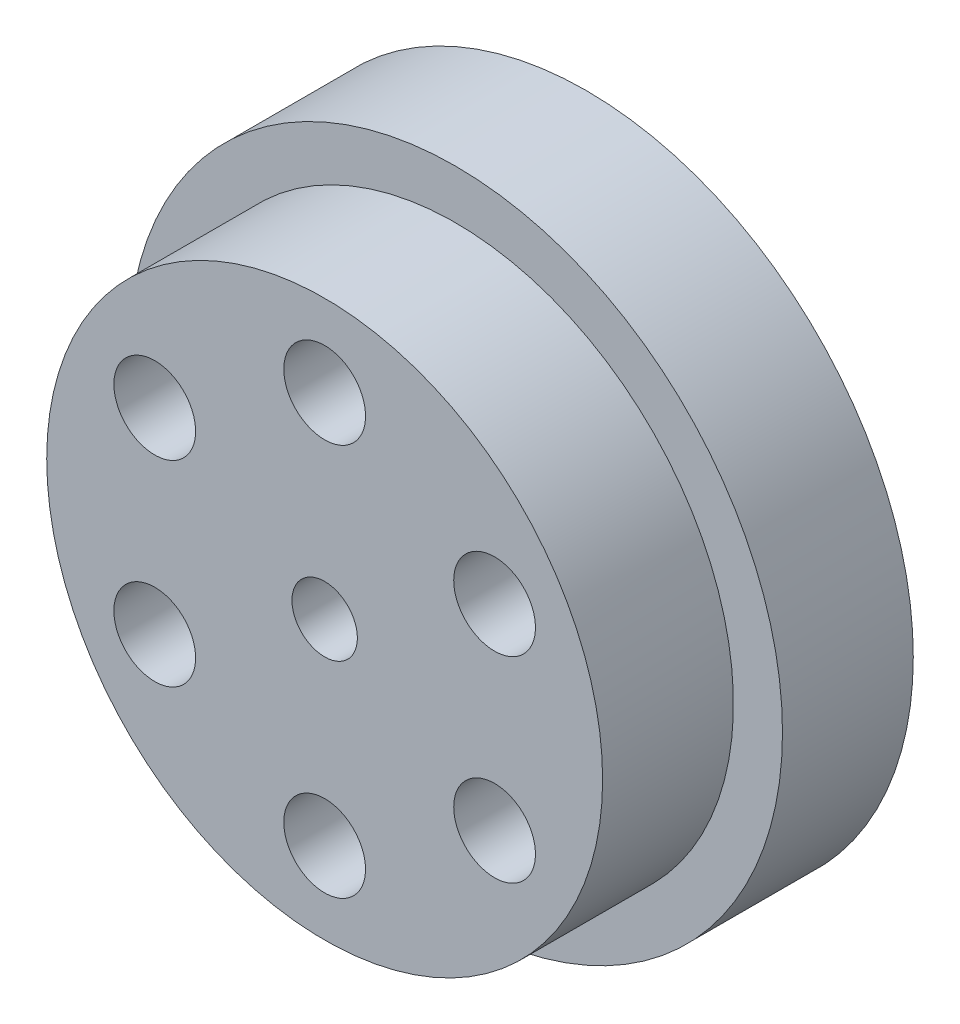
ISO-10303-21;
HEADER;
FILE_DESCRIPTION(('STEP AP214'),'2;1');
FILE_NAME('part.step','',(''),(''),'','','');
FILE_SCHEMA(('AUTOMOTIVE_DESIGN { 1 0 10303 214 1 1 1 1 }'));
ENDSEC;
DATA;
#1=APPLICATION_CONTEXT('core data for automotive mechanical design processes');
#2=APPLICATION_PROTOCOL_DEFINITION('international standard','automotive_design',2000,#1);
#3=PRODUCT_CONTEXT('',#1,'mechanical');
#4=PRODUCT('Part','Part','',(#3));
#5=PRODUCT_RELATED_PRODUCT_CATEGORY('part','',(#4));
#6=PRODUCT_DEFINITION_FORMATION('','',#4);
#7=PRODUCT_DEFINITION_CONTEXT('part definition',#1,'design');
#8=PRODUCT_DEFINITION('design','',#6,#7);
#9=PRODUCT_DEFINITION_SHAPE('','',#8);
#10=(LENGTH_UNIT() NAMED_UNIT(*) SI_UNIT(.MILLI.,.METRE.));
#11=(NAMED_UNIT(*) PLANE_ANGLE_UNIT() SI_UNIT($,.RADIAN.));
#12=(NAMED_UNIT(*) SI_UNIT($,.STERADIAN.) SOLID_ANGLE_UNIT());
#13=UNCERTAINTY_MEASURE_WITH_UNIT(LENGTH_MEASURE(1.E-05),#10,'distance_accuracy_value','');
#14=(GEOMETRIC_REPRESENTATION_CONTEXT(3) GLOBAL_UNCERTAINTY_ASSIGNED_CONTEXT((#13)) GLOBAL_UNIT_ASSIGNED_CONTEXT((#10,
#11,#12)) REPRESENTATION_CONTEXT('',''));
#15=CARTESIAN_POINT('',(0.,0.,0.));
#16=DIRECTION('',(0.,0.,1.));
#17=DIRECTION('',(1.,0.,0.));
#18=AXIS2_PLACEMENT_3D('',#15,#16,#17);
#19=CARTESIAN_POINT('',(0.,0.,5.));
#20=DIRECTION('',(0.,0.,-1.));
#21=DIRECTION('',(-1.,0.,0.));
#22=AXIS2_PLACEMENT_3D('',#19,#20,#21);
#23=CYLINDRICAL_SURFACE('',#22,2.5);
#24=CARTESIAN_POINT('',(0.,0.,-3.));
#25=DIRECTION('',(0.,0.,-1.));
#26=DIRECTION('',(-1.,0.,0.));
#27=AXIS2_PLACEMENT_3D('',#24,#25,#26);
#28=CIRCLE('',#27,2.5);
#29=CARTESIAN_POINT('',(-2.5,0.,-3.));
#30=VERTEX_POINT('',#29);
#31=EDGE_CURVE('E95',#30,#30,#28,.T.);
#32=ORIENTED_EDGE('',*,*,#31,.T.);
#33=EDGE_LOOP('',(#32));
#34=FACE_BOUND('',#33,.T.);
#35=CARTESIAN_POINT('',(0.,0.,-1.));
#36=DIRECTION('',(0.,0.,1.));
#37=DIRECTION('',(1.,0.,0.));
#38=AXIS2_PLACEMENT_3D('',#35,#36,#37);
#39=CIRCLE('',#38,2.5);
#40=CARTESIAN_POINT('',(2.5,0.,-1.));
#41=VERTEX_POINT('',#40);
#42=EDGE_CURVE('E122',#41,#41,#39,.T.);
#43=ORIENTED_EDGE('',*,*,#42,.T.);
#44=EDGE_LOOP('',(#43));
#45=FACE_BOUND('',#44,.T.);
#46=ADVANCED_FACE('F46',(#34,#45),#23,.F.);
#47=CARTESIAN_POINT('',(0.,0.,5.));
#48=DIRECTION('',(0.,0.,-1.));
#49=DIRECTION('',(-1.,0.,0.));
#50=AXIS2_PLACEMENT_3D('',#47,#48,#49);
#51=CYLINDRICAL_SURFACE('',#50,8.5);
#52=CARTESIAN_POINT('',(0.,0.,5.));
#53=DIRECTION('',(0.,0.,1.));
#54=DIRECTION('',(1.,0.,0.));
#55=AXIS2_PLACEMENT_3D('',#52,#53,#54);
#56=CIRCLE('',#55,8.5);
#57=CARTESIAN_POINT('',(8.5,0.,5.));
#58=VERTEX_POINT('',#57);
#59=EDGE_CURVE('E55',#58,#58,#56,.T.);
#60=ORIENTED_EDGE('',*,*,#59,.F.);
#61=EDGE_LOOP('',(#60));
#62=FACE_BOUND('',#61,.T.);
#63=CARTESIAN_POINT('',(0.,0.,1.));
#64=DIRECTION('',(0.,0.,-1.));
#65=DIRECTION('',(-1.,0.,0.));
#66=AXIS2_PLACEMENT_3D('',#63,#64,#65);
#67=CIRCLE('',#66,8.5);
#68=CARTESIAN_POINT('',(-8.5,0.,1.));
#69=VERTEX_POINT('',#68);
#70=EDGE_CURVE('E10',#69,#69,#67,.T.);
#71=ORIENTED_EDGE('',*,*,#70,.F.);
#72=EDGE_LOOP('',(#71));
#73=FACE_BOUND('',#72,.T.);
#74=ADVANCED_FACE('F48',(#62,#73),#51,.T.);
#75=CARTESIAN_POINT('',(0.,0.,5.));
#76=DIRECTION('',(0.,0.,1.));
#77=DIRECTION('',(1.,0.,0.));
#78=AXIS2_PLACEMENT_3D('',#75,#76,#77);
#79=PLANE('',#78);
#80=CARTESIAN_POINT('',(0.,0.,5.));
#81=DIRECTION('',(0.,0.,1.));
#82=DIRECTION('',(1.,0.,0.));
#83=AXIS2_PLACEMENT_3D('',#80,#81,#82);
#84=CIRCLE('',#83,1.);
#85=CARTESIAN_POINT('',(1.,0.,5.));
#86=VERTEX_POINT('',#85);
#87=EDGE_CURVE('E50',#86,#86,#84,.T.);
#88=ORIENTED_EDGE('',*,*,#87,.F.);
#89=EDGE_LOOP('',(#88));
#90=FACE_BOUND('',#89,.T.);
#91=CARTESIAN_POINT('',(0.,6.,5.));
#92=DIRECTION('',(0.,0.,-1.));
#93=DIRECTION('',(-1.,0.,0.));
#94=AXIS2_PLACEMENT_3D('',#91,#92,#93);
#95=CIRCLE('',#94,1.25);
#96=CARTESIAN_POINT('',(-1.25,6.,5.));
#97=VERTEX_POINT('',#96);
#98=EDGE_CURVE('E61',#97,#97,#95,.T.);
#99=ORIENTED_EDGE('',*,*,#98,.T.);
#100=EDGE_LOOP('',(#99));
#101=FACE_BOUND('',#100,.T.);
#102=CARTESIAN_POINT('',(5.19615242270663,3.,5.));
#103=DIRECTION('',(0.,0.,-1.));
#104=DIRECTION('',(-1.,0.,0.));
#105=AXIS2_PLACEMENT_3D('',#102,#103,#104);
#106=CIRCLE('',#105,1.25);
#107=CARTESIAN_POINT('',(3.94615242270663,3.,5.));
#108=VERTEX_POINT('',#107);
#109=EDGE_CURVE('E69',#108,#108,#106,.T.);
#110=ORIENTED_EDGE('',*,*,#109,.T.);
#111=EDGE_LOOP('',(#110));
#112=FACE_BOUND('',#111,.T.);
#113=CARTESIAN_POINT('',(5.19615242270663,-3.,5.));
#114=DIRECTION('',(0.,0.,-1.));
#115=DIRECTION('',(-1.,0.,0.));
#116=AXIS2_PLACEMENT_3D('',#113,#114,#115);
#117=CIRCLE('',#116,1.25);
#118=CARTESIAN_POINT('',(3.94615242270663,-3.,5.));
#119=VERTEX_POINT('',#118);
#120=EDGE_CURVE('E64',#119,#119,#117,.T.);
#121=ORIENTED_EDGE('',*,*,#120,.T.);
#122=EDGE_LOOP('',(#121));
#123=FACE_BOUND('',#122,.T.);
#124=CARTESIAN_POINT('',(0.,-6.,5.));
#125=DIRECTION('',(0.,0.,-1.));
#126=DIRECTION('',(-1.,0.,0.));
#127=AXIS2_PLACEMENT_3D('',#124,#125,#126);
#128=CIRCLE('',#127,1.25);
#129=CARTESIAN_POINT('',(-1.25,-6.,5.));
#130=VERTEX_POINT('',#129);
#131=EDGE_CURVE('E68',#130,#130,#128,.T.);
#132=ORIENTED_EDGE('',*,*,#131,.T.);
#133=EDGE_LOOP('',(#132));
#134=FACE_BOUND('',#133,.T.);
#135=CARTESIAN_POINT('',(-5.19615242270663,-3.,5.));
#136=DIRECTION('',(0.,0.,-1.));
#137=DIRECTION('',(-1.,0.,0.));
#138=AXIS2_PLACEMENT_3D('',#135,#136,#137);
#139=CIRCLE('',#138,1.25);
#140=CARTESIAN_POINT('',(-6.44615242270663,-3.,5.));
#141=VERTEX_POINT('',#140);
#142=EDGE_CURVE('E73',#141,#141,#139,.T.);
#143=ORIENTED_EDGE('',*,*,#142,.T.);
#144=EDGE_LOOP('',(#143));
#145=FACE_BOUND('',#144,.T.);
#146=CARTESIAN_POINT('',(-5.19615242270663,3.,5.));
#147=DIRECTION('',(0.,0.,-1.));
#148=DIRECTION('',(-1.,0.,0.));
#149=AXIS2_PLACEMENT_3D('',#146,#147,#148);
#150=CIRCLE('',#149,1.25);
#151=CARTESIAN_POINT('',(-6.44615242270663,3.,5.));
#152=VERTEX_POINT('',#151);
#153=EDGE_CURVE('E77',#152,#152,#150,.T.);
#154=ORIENTED_EDGE('',*,*,#153,.T.);
#155=EDGE_LOOP('',(#154));
#156=FACE_BOUND('',#155,.T.);
#157=ORIENTED_EDGE('',*,*,#59,.T.);
#158=EDGE_LOOP('',(#157));
#159=FACE_BOUND('',#158,.T.);
#160=ADVANCED_FACE('F137',(#90,#101,#112,#123,#134,#145,#156,#159),#79,.T.);
#161=CARTESIAN_POINT('',(-5.19615242270663,3.,5.));
#162=DIRECTION('',(0.,0.,-1.));
#163=DIRECTION('',(-1.,0.,0.));
#164=AXIS2_PLACEMENT_3D('',#161,#162,#163);
#165=CYLINDRICAL_SURFACE('',#164,1.25);
#166=ORIENTED_EDGE('',*,*,#153,.F.);
#167=EDGE_LOOP('',(#166));
#168=FACE_BOUND('',#167,.T.);
#169=CARTESIAN_POINT('',(-5.19615242270663,3.,-3.));
#170=DIRECTION('',(0.,0.,-1.));
#171=DIRECTION('',(-1.,0.,0.));
#172=AXIS2_PLACEMENT_3D('',#169,#170,#171);
#173=CIRCLE('',#172,1.25);
#174=CARTESIAN_POINT('',(-6.44615242270663,3.,-3.));
#175=VERTEX_POINT('',#174);
#176=EDGE_CURVE('E102',#175,#175,#173,.T.);
#177=ORIENTED_EDGE('',*,*,#176,.T.);
#178=EDGE_LOOP('',(#177));
#179=FACE_BOUND('',#178,.T.);
#180=ADVANCED_FACE('F140',(#168,#179),#165,.F.);
#181=CARTESIAN_POINT('',(-5.19615242270663,-3.,5.));
#182=DIRECTION('',(0.,0.,-1.));
#183=DIRECTION('',(-1.,0.,0.));
#184=AXIS2_PLACEMENT_3D('',#181,#182,#183);
#185=CYLINDRICAL_SURFACE('',#184,1.25);
#186=ORIENTED_EDGE('',*,*,#142,.F.);
#187=EDGE_LOOP('',(#186));
#188=FACE_BOUND('',#187,.T.);
#189=CARTESIAN_POINT('',(-5.19615242270663,-3.,-3.));
#190=DIRECTION('',(0.,0.,-1.));
#191=DIRECTION('',(-1.,0.,0.));
#192=AXIS2_PLACEMENT_3D('',#189,#190,#191);
#193=CIRCLE('',#192,1.25);
#194=CARTESIAN_POINT('',(-6.44615242270663,-3.,-3.));
#195=VERTEX_POINT('',#194);
#196=EDGE_CURVE('E106',#195,#195,#193,.T.);
#197=ORIENTED_EDGE('',*,*,#196,.T.);
#198=EDGE_LOOP('',(#197));
#199=FACE_BOUND('',#198,.T.);
#200=ADVANCED_FACE('F174',(#188,#199),#185,.F.);
#201=CARTESIAN_POINT('',(0.,-6.,5.));
#202=DIRECTION('',(0.,0.,-1.));
#203=DIRECTION('',(-1.,0.,0.));
#204=AXIS2_PLACEMENT_3D('',#201,#202,#203);
#205=CYLINDRICAL_SURFACE('',#204,1.25);
#206=ORIENTED_EDGE('',*,*,#131,.F.);
#207=EDGE_LOOP('',(#206));
#208=FACE_BOUND('',#207,.T.);
#209=CARTESIAN_POINT('',(0.,-6.,-3.));
#210=DIRECTION('',(0.,0.,-1.));
#211=DIRECTION('',(-1.,0.,0.));
#212=AXIS2_PLACEMENT_3D('',#209,#210,#211);
#213=CIRCLE('',#212,1.25);
#214=CARTESIAN_POINT('',(-1.25,-6.,-3.));
#215=VERTEX_POINT('',#214);
#216=EDGE_CURVE('E110',#215,#215,#213,.T.);
#217=ORIENTED_EDGE('',*,*,#216,.T.);
#218=EDGE_LOOP('',(#217));
#219=FACE_BOUND('',#218,.T.);
#220=ADVANCED_FACE('F170',(#208,#219),#205,.F.);
#221=CARTESIAN_POINT('',(5.19615242270663,-3.,5.));
#222=DIRECTION('',(0.,0.,-1.));
#223=DIRECTION('',(-1.,0.,0.));
#224=AXIS2_PLACEMENT_3D('',#221,#222,#223);
#225=CYLINDRICAL_SURFACE('',#224,1.25);
#226=ORIENTED_EDGE('',*,*,#120,.F.);
#227=EDGE_LOOP('',(#226));
#228=FACE_BOUND('',#227,.T.);
#229=CARTESIAN_POINT('',(5.19615242270663,-3.,-3.));
#230=DIRECTION('',(0.,0.,-1.));
#231=DIRECTION('',(-1.,0.,0.));
#232=AXIS2_PLACEMENT_3D('',#229,#230,#231);
#233=CIRCLE('',#232,1.25);
#234=CARTESIAN_POINT('',(3.94615242270663,-3.,-3.));
#235=VERTEX_POINT('',#234);
#236=EDGE_CURVE('E114',#235,#235,#233,.T.);
#237=ORIENTED_EDGE('',*,*,#236,.T.);
#238=EDGE_LOOP('',(#237));
#239=FACE_BOUND('',#238,.T.);
#240=ADVANCED_FACE('F166',(#228,#239),#225,.F.);
#241=CARTESIAN_POINT('',(5.19615242270663,3.,5.));
#242=DIRECTION('',(0.,0.,-1.));
#243=DIRECTION('',(-1.,0.,0.));
#244=AXIS2_PLACEMENT_3D('',#241,#242,#243);
#245=CYLINDRICAL_SURFACE('',#244,1.25);
#246=ORIENTED_EDGE('',*,*,#109,.F.);
#247=EDGE_LOOP('',(#246));
#248=FACE_BOUND('',#247,.T.);
#249=CARTESIAN_POINT('',(5.19615242270663,3.,-3.));
#250=DIRECTION('',(0.,0.,-1.));
#251=DIRECTION('',(-1.,0.,0.));
#252=AXIS2_PLACEMENT_3D('',#249,#250,#251);
#253=CIRCLE('',#252,1.25);
#254=CARTESIAN_POINT('',(3.94615242270663,3.,-3.));
#255=VERTEX_POINT('',#254);
#256=EDGE_CURVE('E118',#255,#255,#253,.T.);
#257=ORIENTED_EDGE('',*,*,#256,.T.);
#258=EDGE_LOOP('',(#257));
#259=FACE_BOUND('',#258,.T.);
#260=ADVANCED_FACE('F169',(#248,#259),#245,.F.);
#261=CARTESIAN_POINT('',(0.,6.,5.));
#262=DIRECTION('',(0.,0.,-1.));
#263=DIRECTION('',(-1.,0.,0.));
#264=AXIS2_PLACEMENT_3D('',#261,#262,#263);
#265=CYLINDRICAL_SURFACE('',#264,1.25);
#266=ORIENTED_EDGE('',*,*,#98,.F.);
#267=EDGE_LOOP('',(#266));
#268=FACE_BOUND('',#267,.T.);
#269=CARTESIAN_POINT('',(0.,6.,-3.));
#270=DIRECTION('',(0.,0.,-1.));
#271=DIRECTION('',(-1.,0.,0.));
#272=AXIS2_PLACEMENT_3D('',#269,#270,#271);
#273=CIRCLE('',#272,1.25);
#274=CARTESIAN_POINT('',(-1.25,6.,-3.));
#275=VERTEX_POINT('',#274);
#276=EDGE_CURVE('E99',#275,#275,#273,.T.);
#277=ORIENTED_EDGE('',*,*,#276,.T.);
#278=EDGE_LOOP('',(#277));
#279=FACE_BOUND('',#278,.T.);
#280=ADVANCED_FACE('F184',(#268,#279),#265,.F.);
#281=CARTESIAN_POINT('',(0.,0.,1.));
#282=DIRECTION('',(0.,0.,-1.));
#283=DIRECTION('',(-1.,0.,0.));
#284=AXIS2_PLACEMENT_3D('',#281,#282,#283);
#285=CYLINDRICAL_SURFACE('',#284,10.);
#286=CARTESIAN_POINT('',(0.,0.,1.));
#287=DIRECTION('',(0.,0.,-1.));
#288=DIRECTION('',(-1.,0.,0.));
#289=AXIS2_PLACEMENT_3D('',#286,#287,#288);
#290=CIRCLE('',#289,10.);
#291=CARTESIAN_POINT('',(-10.,0.,1.));
#292=VERTEX_POINT('',#291);
#293=EDGE_CURVE('E84',#292,#292,#290,.T.);
#294=ORIENTED_EDGE('',*,*,#293,.T.);
#295=EDGE_LOOP('',(#294));
#296=FACE_BOUND('',#295,.T.);
#297=CARTESIAN_POINT('',(0.,0.,-3.));
#298=DIRECTION('',(0.,0.,-1.));
#299=DIRECTION('',(-1.,0.,0.));
#300=AXIS2_PLACEMENT_3D('',#297,#298,#299);
#301=CIRCLE('',#300,10.);
#302=CARTESIAN_POINT('',(-10.,0.,-3.));
#303=VERTEX_POINT('',#302);
#304=EDGE_CURVE('E91',#303,#303,#301,.T.);
#305=ORIENTED_EDGE('',*,*,#304,.F.);
#306=EDGE_LOOP('',(#305));
#307=FACE_BOUND('',#306,.T.);
#308=ADVANCED_FACE('F188',(#296,#307),#285,.T.);
#309=CARTESIAN_POINT('',(0.,0.,1.));
#310=DIRECTION('',(0.,0.,-1.));
#311=DIRECTION('',(-1.,0.,0.));
#312=AXIS2_PLACEMENT_3D('',#309,#310,#311);
#313=PLANE('',#312);
#314=ORIENTED_EDGE('',*,*,#70,.T.);
#315=EDGE_LOOP('',(#314));
#316=FACE_BOUND('',#315,.T.);
#317=ORIENTED_EDGE('',*,*,#293,.F.);
#318=EDGE_LOOP('',(#317));
#319=FACE_BOUND('',#318,.T.);
#320=ADVANCED_FACE('F192',(#316,#319),#313,.F.);
#321=CARTESIAN_POINT('',(0.,0.,-3.));
#322=DIRECTION('',(0.,0.,-1.));
#323=DIRECTION('',(-1.,0.,0.));
#324=AXIS2_PLACEMENT_3D('',#321,#322,#323);
#325=PLANE('',#324);
#326=ORIENTED_EDGE('',*,*,#236,.F.);
#327=EDGE_LOOP('',(#326));
#328=FACE_BOUND('',#327,.T.);
#329=ORIENTED_EDGE('',*,*,#196,.F.);
#330=EDGE_LOOP('',(#329));
#331=FACE_BOUND('',#330,.T.);
#332=ORIENTED_EDGE('',*,*,#276,.F.);
#333=EDGE_LOOP('',(#332));
#334=FACE_BOUND('',#333,.T.);
#335=ORIENTED_EDGE('',*,*,#304,.T.);
#336=EDGE_LOOP('',(#335));
#337=FACE_BOUND('',#336,.T.);
#338=ORIENTED_EDGE('',*,*,#31,.F.);
#339=EDGE_LOOP('',(#338));
#340=FACE_BOUND('',#339,.T.);
#341=ORIENTED_EDGE('',*,*,#176,.F.);
#342=EDGE_LOOP('',(#341));
#343=FACE_BOUND('',#342,.T.);
#344=ORIENTED_EDGE('',*,*,#216,.F.);
#345=EDGE_LOOP('',(#344));
#346=FACE_BOUND('',#345,.T.);
#347=ORIENTED_EDGE('',*,*,#256,.F.);
#348=EDGE_LOOP('',(#347));
#349=FACE_BOUND('',#348,.T.);
#350=ADVANCED_FACE('F196',(#328,#331,#334,#337,#340,#343,#346,#349),#325,.T.);
#351=CARTESIAN_POINT('',(0.,0.,-1.));
#352=DIRECTION('',(0.,0.,1.));
#353=DIRECTION('',(1.,0.,0.));
#354=AXIS2_PLACEMENT_3D('',#351,#352,#353);
#355=PLANE('',#354);
#356=CARTESIAN_POINT('',(0.,0.,-1.));
#357=DIRECTION('',(0.,0.,-1.));
#358=DIRECTION('',(-1.,0.,0.));
#359=AXIS2_PLACEMENT_3D('',#356,#357,#358);
#360=CIRCLE('',#359,1.);
#361=CARTESIAN_POINT('',(-1.,0.,-1.));
#362=VERTEX_POINT('',#361);
#363=EDGE_CURVE('E126',#362,#362,#360,.T.);
#364=ORIENTED_EDGE('',*,*,#363,.F.);
#365=EDGE_LOOP('',(#364));
#366=FACE_BOUND('',#365,.T.);
#367=ORIENTED_EDGE('',*,*,#42,.F.);
#368=EDGE_LOOP('',(#367));
#369=FACE_BOUND('',#368,.T.);
#370=ADVANCED_FACE('F199',(#366,#369),#355,.F.);
#371=CARTESIAN_POINT('',(0.,0.,9.));
#372=DIRECTION('',(0.,0.,-1.));
#373=DIRECTION('',(-1.,0.,0.));
#374=AXIS2_PLACEMENT_3D('',#371,#372,#373);
#375=CYLINDRICAL_SURFACE('',#374,1.);
#376=ORIENTED_EDGE('',*,*,#87,.T.);
#377=EDGE_LOOP('',(#376));
#378=FACE_BOUND('',#377,.T.);
#379=ORIENTED_EDGE('',*,*,#363,.T.);
#380=EDGE_LOOP('',(#379));
#381=FACE_BOUND('',#380,.T.);
#382=ADVANCED_FACE('F135',(#378,#381),#375,.F.);
#383=CLOSED_SHELL('',(#46,#74,#160,#180,#200,#220,#240,#260,#280,#308,#320,#350,#370,#382));
#384=MANIFOLD_SOLID_BREP('B2',#383);
#385=ADVANCED_BREP_SHAPE_REPRESENTATION('',(#18,#384),#14);
#386=SHAPE_DEFINITION_REPRESENTATION(#9,#385);
ENDSEC;
END-ISO-10303-21;
